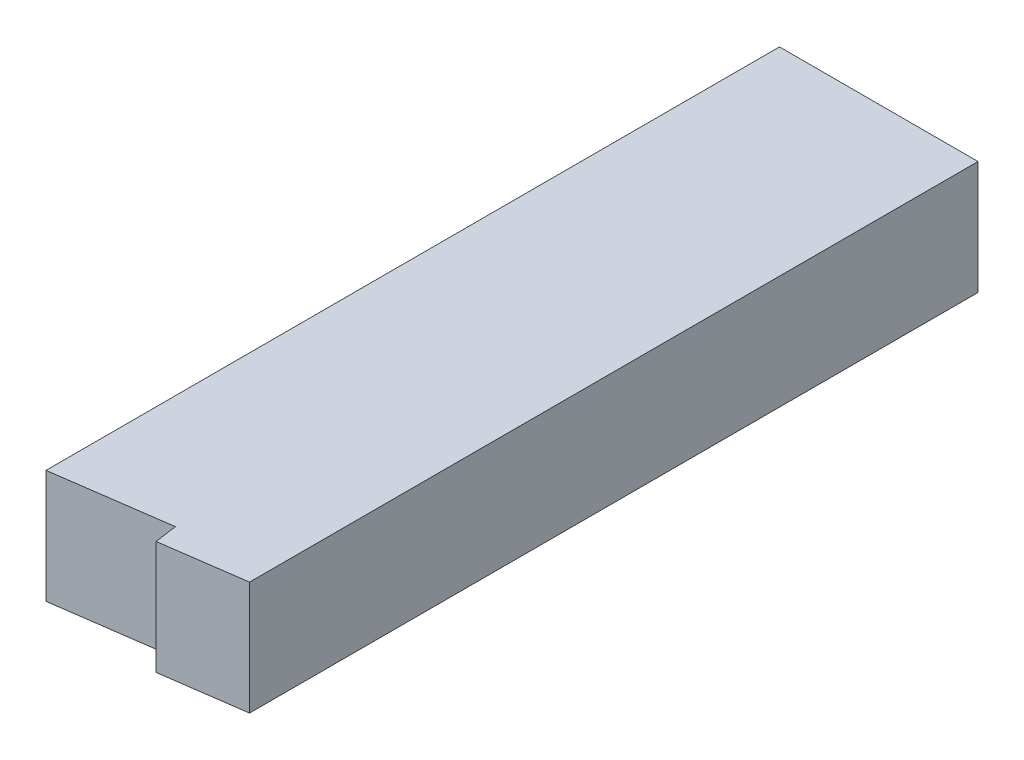
ISO-10303-21;
HEADER;
FILE_DESCRIPTION(('STEP AP214'),'2;1');
FILE_NAME('part.step','',(''),(''),'','','');
FILE_SCHEMA(('AUTOMOTIVE_DESIGN { 1 0 10303 214 1 1 1 1 }'));
ENDSEC;
DATA;
#1=APPLICATION_CONTEXT('core data for automotive mechanical design processes');
#2=APPLICATION_PROTOCOL_DEFINITION('international standard','automotive_design',2000,#1);
#3=PRODUCT_CONTEXT('',#1,'mechanical');
#4=PRODUCT('Part','Part','',(#3));
#5=PRODUCT_RELATED_PRODUCT_CATEGORY('part','',(#4));
#6=PRODUCT_DEFINITION_FORMATION('','',#4);
#7=PRODUCT_DEFINITION_CONTEXT('part definition',#1,'design');
#8=PRODUCT_DEFINITION('design','',#6,#7);
#9=PRODUCT_DEFINITION_SHAPE('','',#8);
#10=(LENGTH_UNIT() NAMED_UNIT(*) SI_UNIT(.MILLI.,.METRE.));
#11=(NAMED_UNIT(*) PLANE_ANGLE_UNIT() SI_UNIT($,.RADIAN.));
#12=(NAMED_UNIT(*) SI_UNIT($,.STERADIAN.) SOLID_ANGLE_UNIT());
#13=UNCERTAINTY_MEASURE_WITH_UNIT(LENGTH_MEASURE(1.E-05),#10,'distance_accuracy_value','');
#14=(GEOMETRIC_REPRESENTATION_CONTEXT(3) GLOBAL_UNCERTAINTY_ASSIGNED_CONTEXT((#13)) GLOBAL_UNIT_ASSIGNED_CONTEXT((#10,
#11,#12)) REPRESENTATION_CONTEXT('',''));
#15=CARTESIAN_POINT('',(0.,0.,0.));
#16=DIRECTION('',(0.,0.,1.));
#17=DIRECTION('',(1.,0.,0.));
#18=AXIS2_PLACEMENT_3D('',#15,#16,#17);
#19=CARTESIAN_POINT('',(-50.8,25.4,331.365720046));
#20=DIRECTION('',(0.,-1.,0.));
#21=DIRECTION('',(0.,0.,-1.));
#22=AXIS2_PLACEMENT_3D('',#19,#20,#21);
#23=PLANE('',#22);
#24=DIRECTION('',(-0.99026806874157,0.,0.139173100960066));
#25=VECTOR('',#24,1.);
#26=CARTESIAN_POINT('',(-49.7886591209301,25.4,338.561784315943));
#27=LINE('',#26,#25);
#28=CARTESIAN_POINT('',(38.1,25.4,326.209838802214));
#29=VERTEX_POINT('',#28);
#30=CARTESIAN_POINT('',(1.41399870575459,25.400006,331.365720046));
#31=VERTEX_POINT('',#30);
#32=EDGE_CURVE('E162',#29,#31,#27,.T.);
#33=ORIENTED_EDGE('',*,*,#32,.F.);
#34=DIRECTION('',(0.,0.,-1.));
#35=VECTOR('',#34,1.);
#36=CARTESIAN_POINT('',(38.1,25.4,331.365720046));
#37=LINE('',#36,#35);
#38=CARTESIAN_POINT('',(38.1,25.4,0.));
#39=VERTEX_POINT('',#38);
#40=EDGE_CURVE('E95',#29,#39,#37,.T.);
#41=ORIENTED_EDGE('',*,*,#40,.T.);
#42=DIRECTION('',(-1.,0.,0.));
#43=VECTOR('',#42,1.);
#44=CARTESIAN_POINT('',(-50.8,25.4,0.));
#45=LINE('',#44,#43);
#46=CARTESIAN_POINT('',(-50.8,25.4,0.));
#47=VERTEX_POINT('',#46);
#48=EDGE_CURVE('E147',#39,#47,#45,.T.);
#49=ORIENTED_EDGE('',*,*,#48,.T.);
#50=DIRECTION('',(0.,0.,-1.));
#51=VECTOR('',#50,1.);
#52=CARTESIAN_POINT('',(-50.8,25.4,331.365720046));
#53=LINE('',#52,#51);
#54=CARTESIAN_POINT('',(-50.8,25.4,328.444070870467));
#55=VERTEX_POINT('',#54);
#56=EDGE_CURVE('E89',#55,#47,#53,.T.);
#57=ORIENTED_EDGE('',*,*,#56,.F.);
#58=DIRECTION('',(-0.99026806874157,0.,0.139173100960065));
#59=VECTOR('',#58,1.);
#60=CARTESIAN_POINT('',(-51.2026578266844,25.4,328.500660737529));
#61=LINE('',#60,#59);
#62=CARTESIAN_POINT('',(0.,25.4,321.304596467586));
#63=VERTEX_POINT('',#62);
#64=EDGE_CURVE('E186',#63,#55,#61,.T.);
#65=ORIENTED_EDGE('',*,*,#64,.F.);
#66=DIRECTION('',(-0.139173100960065,0.,-0.99026806874157));
#67=VECTOR('',#66,1.);
#68=CARTESIAN_POINT('',(0.402657826684388,25.4,324.169655776057));
#69=LINE('',#68,#67);
#70=EDGE_CURVE('E181',#31,#63,#69,.T.);
#71=ORIENTED_EDGE('',*,*,#70,.F.);
#72=EDGE_LOOP('',(#33,#41,#49,#57,#65,#71));
#73=FACE_BOUND('',#72,.T.);
#74=ADVANCED_FACE('F81',(#73),#23,.F.);
#75=CARTESIAN_POINT('',(-50.8,-25.4,331.365720046));
#76=DIRECTION('',(0.,1.,0.));
#77=DIRECTION('',(0.,0.,1.));
#78=AXIS2_PLACEMENT_3D('',#75,#76,#77);
#79=PLANE('',#78);
#80=DIRECTION('',(1.,0.,0.));
#81=VECTOR('',#80,1.);
#82=CARTESIAN_POINT('',(-50.8,-25.4,0.));
#83=LINE('',#82,#81);
#84=CARTESIAN_POINT('',(-50.8,-25.4,0.));
#85=VERTEX_POINT('',#84);
#86=CARTESIAN_POINT('',(38.1,-25.4,0.));
#87=VERTEX_POINT('',#86);
#88=EDGE_CURVE('E146',#85,#87,#83,.T.);
#89=ORIENTED_EDGE('',*,*,#88,.T.);
#90=DIRECTION('',(0.,0.,-1.));
#91=VECTOR('',#90,1.);
#92=CARTESIAN_POINT('',(38.1,-25.4,355.6));
#93=LINE('',#92,#91);
#94=CARTESIAN_POINT('',(38.1,-25.4,326.209838802214));
#95=VERTEX_POINT('',#94);
#96=EDGE_CURVE('E133',#95,#87,#93,.T.);
#97=ORIENTED_EDGE('',*,*,#96,.F.);
#98=DIRECTION('',(0.99026806874157,0.,-0.139173100960066));
#99=VECTOR('',#98,1.);
#100=CARTESIAN_POINT('',(45.6957733968411,-25.4,325.142322468811));
#101=LINE('',#100,#99);
#102=CARTESIAN_POINT('',(1.41399870575459,-25.4,331.365720046));
#103=VERTEX_POINT('',#102);
#104=EDGE_CURVE('E198',#103,#95,#101,.T.);
#105=ORIENTED_EDGE('',*,*,#104,.F.);
#106=DIRECTION('',(0.139173100960065,0.,0.99026806874157));
#107=VECTOR('',#106,1.);
#108=CARTESIAN_POINT('',(-44.2817746910866,-25.4,6.22339757718854));
#109=LINE('',#108,#107);
#110=CARTESIAN_POINT('',(0.,-25.4,321.304596467586));
#111=VERTEX_POINT('',#110);
#112=EDGE_CURVE('E208',#111,#103,#109,.T.);
#113=ORIENTED_EDGE('',*,*,#112,.F.);
#114=DIRECTION('',(0.99026806874157,0.,-0.139173100960065));
#115=VECTOR('',#114,1.);
#116=CARTESIAN_POINT('',(44.2817746910866,-25.4,315.081198890397));
#117=LINE('',#116,#115);
#118=CARTESIAN_POINT('',(-50.8,-25.4,328.444070870467));
#119=VERTEX_POINT('',#118);
#120=EDGE_CURVE('E189',#119,#111,#117,.T.);
#121=ORIENTED_EDGE('',*,*,#120,.F.);
#122=DIRECTION('',(0.,0.,-1.));
#123=VECTOR('',#122,1.);
#124=CARTESIAN_POINT('',(-50.8,-25.4,331.365720046));
#125=LINE('',#124,#123);
#126=EDGE_CURVE('E103',#119,#85,#125,.T.);
#127=ORIENTED_EDGE('',*,*,#126,.T.);
#128=EDGE_LOOP('',(#89,#97,#105,#113,#121,#127));
#129=FACE_BOUND('',#128,.T.);
#130=ADVANCED_FACE('F150',(#129),#79,.F.);
#131=CARTESIAN_POINT('',(-50.8,25.4,331.365720046));
#132=DIRECTION('',(1.,0.,0.));
#133=DIRECTION('',(0.,1.,0.));
#134=AXIS2_PLACEMENT_3D('',#131,#132,#133);
#135=PLANE('',#134);
#136=DIRECTION('',(0.,1.,0.));
#137=VECTOR('',#136,1.);
#138=CARTESIAN_POINT('',(-50.8,-25.4,328.444070870467));
#139=LINE('',#138,#137);
#140=EDGE_CURVE('E178',#119,#55,#139,.T.);
#141=ORIENTED_EDGE('',*,*,#140,.T.);
#142=ORIENTED_EDGE('',*,*,#56,.T.);
#143=DIRECTION('',(0.,-1.,0.));
#144=VECTOR('',#143,1.);
#145=CARTESIAN_POINT('',(-50.8,25.4,0.));
#146=LINE('',#145,#144);
#147=EDGE_CURVE('E152',#47,#85,#146,.T.);
#148=ORIENTED_EDGE('',*,*,#147,.T.);
#149=ORIENTED_EDGE('',*,*,#126,.F.);
#150=EDGE_LOOP('',(#141,#142,#148,#149));
#151=FACE_BOUND('',#150,.T.);
#152=ADVANCED_FACE('F177',(#151),#135,.F.);
#153=CARTESIAN_POINT('',(0.,0.,0.));
#154=DIRECTION('',(0.,0.,1.));
#155=DIRECTION('',(1.,0.,0.));
#156=AXIS2_PLACEMENT_3D('',#153,#154,#155);
#157=PLANE('',#156);
#158=ORIENTED_EDGE('',*,*,#48,.F.);
#159=DIRECTION('',(0.,-1.,0.));
#160=VECTOR('',#159,1.);
#161=CARTESIAN_POINT('',(38.1,25.400256,0.));
#162=LINE('',#161,#160);
#163=EDGE_CURVE('E136',#39,#87,#162,.T.);
#164=ORIENTED_EDGE('',*,*,#163,.T.);
#165=ORIENTED_EDGE('',*,*,#88,.F.);
#166=ORIENTED_EDGE('',*,*,#147,.F.);
#167=EDGE_LOOP('',(#158,#164,#165,#166));
#168=FACE_BOUND('',#167,.T.);
#169=ADVANCED_FACE('F144',(#168),#157,.F.);
#170=CARTESIAN_POINT('',(45.6957733968411,-25.4,325.142322468811));
#171=DIRECTION('',(0.139173100960066,0.,0.99026806874157));
#172=DIRECTION('',(0.99026806874157,0.,-0.139173100960066));
#173=AXIS2_PLACEMENT_3D('',#170,#171,#172);
#174=PLANE('',#173);
#175=DIRECTION('',(0.,-1.,0.));
#176=VECTOR('',#175,1.);
#177=CARTESIAN_POINT('',(38.1,-25.4,326.209838802214));
#178=LINE('',#177,#176);
#179=EDGE_CURVE('E12',#29,#95,#178,.T.);
#180=ORIENTED_EDGE('',*,*,#179,.F.);
#181=ORIENTED_EDGE('',*,*,#32,.T.);
#182=DIRECTION('',(0.,1.,0.));
#183=VECTOR('',#182,1.);
#184=CARTESIAN_POINT('',(1.41399870575459,-25.4,331.365720046));
#185=LINE('',#184,#183);
#186=EDGE_CURVE('E165',#103,#31,#185,.T.);
#187=ORIENTED_EDGE('',*,*,#186,.F.);
#188=ORIENTED_EDGE('',*,*,#104,.T.);
#189=EDGE_LOOP('',(#180,#181,#187,#188));
#190=FACE_BOUND('',#189,.T.);
#191=ADVANCED_FACE('F215',(#190),#174,.T.);
#192=CARTESIAN_POINT('',(44.2817746910866,-25.4,315.081198890397));
#193=DIRECTION('',(0.139173100960065,0.,0.99026806874157));
#194=DIRECTION('',(0.99026806874157,0.,-0.139173100960065));
#195=AXIS2_PLACEMENT_3D('',#192,#193,#194);
#196=PLANE('',#195);
#197=ORIENTED_EDGE('',*,*,#64,.T.);
#198=ORIENTED_EDGE('',*,*,#140,.F.);
#199=ORIENTED_EDGE('',*,*,#120,.T.);
#200=DIRECTION('',(0.,1.,0.));
#201=VECTOR('',#200,1.);
#202=CARTESIAN_POINT('',(0.,-25.4,321.304596467586));
#203=LINE('',#202,#201);
#204=EDGE_CURVE('E182',#111,#63,#203,.T.);
#205=ORIENTED_EDGE('',*,*,#204,.T.);
#206=EDGE_LOOP('',(#197,#198,#199,#205));
#207=FACE_BOUND('',#206,.T.);
#208=ADVANCED_FACE('F210',(#207),#196,.T.);
#209=CARTESIAN_POINT('',(-44.2817746910866,-25.4,6.22339757718854));
#210=DIRECTION('',(-0.99026806874157,0.,0.139173100960065));
#211=DIRECTION('',(0.139173100960065,0.,0.99026806874157));
#212=AXIS2_PLACEMENT_3D('',#209,#210,#211);
#213=PLANE('',#212);
#214=ORIENTED_EDGE('',*,*,#70,.T.);
#215=ORIENTED_EDGE('',*,*,#204,.F.);
#216=ORIENTED_EDGE('',*,*,#112,.T.);
#217=ORIENTED_EDGE('',*,*,#186,.T.);
#218=EDGE_LOOP('',(#214,#215,#216,#217));
#219=FACE_BOUND('',#218,.T.);
#220=ADVANCED_FACE('F205',(#219),#213,.T.);
#221=CARTESIAN_POINT('',(38.1,25.400256,355.6));
#222=DIRECTION('',(-1.,0.,0.));
#223=DIRECTION('',(0.,0.,1.));
#224=AXIS2_PLACEMENT_3D('',#221,#222,#223);
#225=PLANE('',#224);
#226=ORIENTED_EDGE('',*,*,#179,.T.);
#227=ORIENTED_EDGE('',*,*,#96,.T.);
#228=ORIENTED_EDGE('',*,*,#163,.F.);
#229=ORIENTED_EDGE('',*,*,#40,.F.);
#230=EDGE_LOOP('',(#226,#227,#228,#229));
#231=FACE_BOUND('',#230,.T.);
#232=ADVANCED_FACE('F135',(#231),#225,.F.);
#233=CLOSED_SHELL('',(#74,#130,#152,#169,#191,#208,#220,#232));
#234=MANIFOLD_SOLID_BREP('B2',#233);
#235=ADVANCED_BREP_SHAPE_REPRESENTATION('',(#18,#234),#14);
#236=SHAPE_DEFINITION_REPRESENTATION(#9,#235);
ENDSEC;
END-ISO-10303-21;
